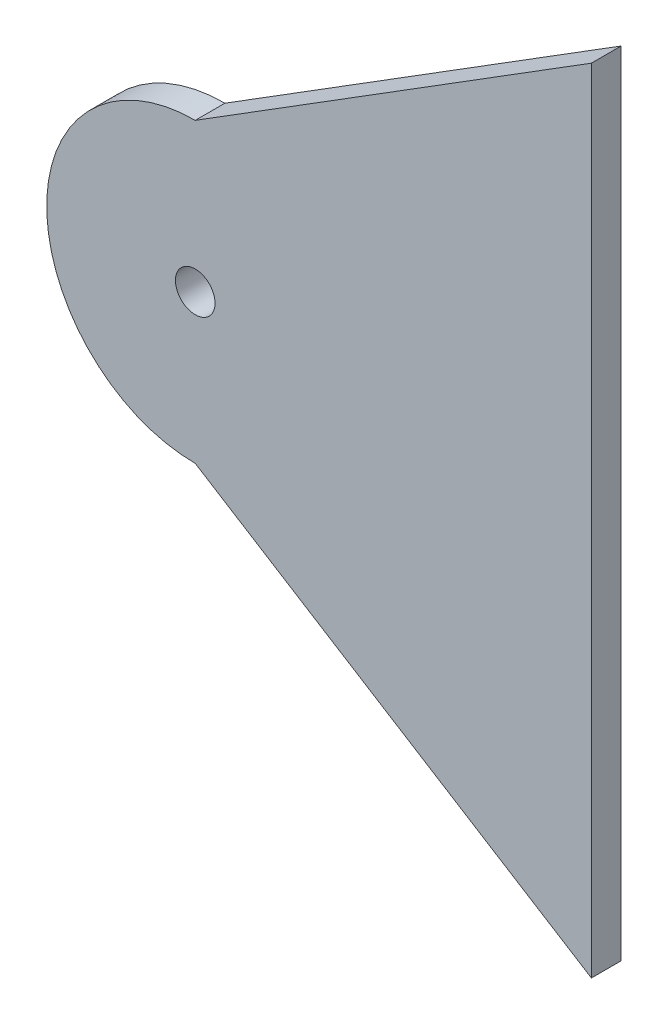
ISO-10303-21;
HEADER;
FILE_DESCRIPTION(('STEP AP214'),'2;1');
FILE_NAME('part.step','',(''),(''),'','','');
FILE_SCHEMA(('AUTOMOTIVE_DESIGN { 1 0 10303 214 1 1 1 1 }'));
ENDSEC;
DATA;
#1=APPLICATION_CONTEXT('core data for automotive mechanical design processes');
#2=APPLICATION_PROTOCOL_DEFINITION('international standard','automotive_design',2000,#1);
#3=PRODUCT_CONTEXT('',#1,'mechanical');
#4=PRODUCT('Part','Part','',(#3));
#5=PRODUCT_RELATED_PRODUCT_CATEGORY('part','',(#4));
#6=PRODUCT_DEFINITION_FORMATION('','',#4);
#7=PRODUCT_DEFINITION_CONTEXT('part definition',#1,'design');
#8=PRODUCT_DEFINITION('design','',#6,#7);
#9=PRODUCT_DEFINITION_SHAPE('','',#8);
#10=(LENGTH_UNIT() NAMED_UNIT(*) SI_UNIT(.MILLI.,.METRE.));
#11=(NAMED_UNIT(*) PLANE_ANGLE_UNIT() SI_UNIT($,.RADIAN.));
#12=(NAMED_UNIT(*) SI_UNIT($,.STERADIAN.) SOLID_ANGLE_UNIT());
#13=UNCERTAINTY_MEASURE_WITH_UNIT(LENGTH_MEASURE(1.E-05),#10,'distance_accuracy_value','');
#14=(GEOMETRIC_REPRESENTATION_CONTEXT(3) GLOBAL_UNCERTAINTY_ASSIGNED_CONTEXT((#13)) GLOBAL_UNIT_ASSIGNED_CONTEXT((#10,
#11,#12)) REPRESENTATION_CONTEXT('',''));
#15=CARTESIAN_POINT('',(0.,0.,0.));
#16=DIRECTION('',(0.,0.,1.));
#17=DIRECTION('',(1.,0.,0.));
#18=AXIS2_PLACEMENT_3D('',#15,#16,#17);
#19=CARTESIAN_POINT('',(254.00258186926,13.7078609778799,3.));
#20=DIRECTION('',(0.,0.,-1.));
#21=DIRECTION('',(-1.,0.,0.));
#22=AXIS2_PLACEMENT_3D('',#19,#20,#21);
#23=PLANE('',#22);
#24=CARTESIAN_POINT('',(254.00258186926,13.7078609778799,3.));
#25=DIRECTION('',(0.,0.,1.));
#26=DIRECTION('',(-1.,0.,0.));
#27=AXIS2_PLACEMENT_3D('',#24,#25,#26);
#28=CIRCLE('',#27,15.);
#29=CARTESIAN_POINT('',(254.00258186926,28.7078609778799,3.));
#30=VERTEX_POINT('',#29);
#31=CARTESIAN_POINT('',(254.00258186926,-1.29213902212011,3.));
#32=VERTEX_POINT('',#31);
#33=EDGE_CURVE('E86',#30,#32,#28,.T.);
#34=ORIENTED_EDGE('',*,*,#33,.T.);
#35=DIRECTION('',(0.847998304005088,-0.52999894000318,0.));
#36=VECTOR('',#35,1.);
#37=CARTESIAN_POINT('',(294.00258186926,-26.2921390221201,3.));
#38=LINE('',#37,#36);
#39=CARTESIAN_POINT('',(294.00258186926,-26.2921390221201,3.));
#40=VERTEX_POINT('',#39);
#41=EDGE_CURVE('E81',#32,#40,#38,.T.);
#42=ORIENTED_EDGE('',*,*,#41,.T.);
#43=DIRECTION('',(0.,1.,0.));
#44=VECTOR('',#43,1.);
#45=CARTESIAN_POINT('',(294.00258186926,13.7078609778799,3.));
#46=LINE('',#45,#44);
#47=CARTESIAN_POINT('',(294.00258186926,53.7078609778799,3.));
#48=VERTEX_POINT('',#47);
#49=EDGE_CURVE('E84',#40,#48,#46,.T.);
#50=ORIENTED_EDGE('',*,*,#49,.T.);
#51=DIRECTION('',(-0.847998304005088,-0.52999894000318,0.));
#52=VECTOR('',#51,1.);
#53=CARTESIAN_POINT('',(254.00258186926,28.7078609778799,3.));
#54=LINE('',#53,#52);
#55=EDGE_CURVE('E52',#48,#30,#54,.T.);
#56=ORIENTED_EDGE('',*,*,#55,.T.);
#57=EDGE_LOOP('',(#34,#42,#50,#56));
#58=FACE_BOUND('',#57,.T.);
#59=CARTESIAN_POINT('',(254.00258186926,13.7078609778799,3.));
#60=DIRECTION('',(0.,0.,1.));
#61=DIRECTION('',(1.,0.,0.));
#62=AXIS2_PLACEMENT_3D('',#59,#60,#61);
#63=CIRCLE('',#62,2.);
#64=CARTESIAN_POINT('',(256.00258186926,13.7078609778799,3.));
#65=VERTEX_POINT('',#64);
#66=EDGE_CURVE('E102',#65,#65,#63,.T.);
#67=ORIENTED_EDGE('',*,*,#66,.F.);
#68=EDGE_LOOP('',(#67));
#69=FACE_BOUND('',#68,.T.);
#70=ADVANCED_FACE('F35',(#58,#69),#23,.F.);
#71=CARTESIAN_POINT('',(254.00258186926,13.7078609778799,0.));
#72=DIRECTION('',(0.,0.,-1.));
#73=DIRECTION('',(-1.,0.,0.));
#74=AXIS2_PLACEMENT_3D('',#71,#72,#73);
#75=PLANE('',#74);
#76=CARTESIAN_POINT('',(254.00258186926,13.7078609778799,0.));
#77=DIRECTION('',(0.,0.,1.));
#78=DIRECTION('',(-1.,0.,0.));
#79=AXIS2_PLACEMENT_3D('',#76,#77,#78);
#80=CIRCLE('',#79,15.);
#81=CARTESIAN_POINT('',(254.00258186926,28.7078609778799,0.));
#82=VERTEX_POINT('',#81);
#83=CARTESIAN_POINT('',(254.00258186926,-1.29213902212011,0.));
#84=VERTEX_POINT('',#83);
#85=EDGE_CURVE('E99',#82,#84,#80,.T.);
#86=ORIENTED_EDGE('',*,*,#85,.F.);
#87=DIRECTION('',(-0.847998304005088,-0.52999894000318,0.));
#88=VECTOR('',#87,1.);
#89=CARTESIAN_POINT('',(254.00258186926,28.7078609778799,0.));
#90=LINE('',#89,#88);
#91=CARTESIAN_POINT('',(294.00258186926,53.7078609778799,0.));
#92=VERTEX_POINT('',#91);
#93=EDGE_CURVE('E74',#92,#82,#90,.T.);
#94=ORIENTED_EDGE('',*,*,#93,.F.);
#95=DIRECTION('',(0.,1.,0.));
#96=VECTOR('',#95,1.);
#97=CARTESIAN_POINT('',(294.00258186926,13.7078609778799,0.));
#98=LINE('',#97,#96);
#99=CARTESIAN_POINT('',(294.00258186926,-26.2921390221201,0.));
#100=VERTEX_POINT('',#99);
#101=EDGE_CURVE('E68',#100,#92,#98,.T.);
#102=ORIENTED_EDGE('',*,*,#101,.F.);
#103=DIRECTION('',(0.847998304005088,-0.52999894000318,0.));
#104=VECTOR('',#103,1.);
#105=CARTESIAN_POINT('',(294.00258186926,-26.2921390221201,0.));
#106=LINE('',#105,#104);
#107=EDGE_CURVE('E91',#84,#100,#106,.T.);
#108=ORIENTED_EDGE('',*,*,#107,.F.);
#109=EDGE_LOOP('',(#86,#94,#102,#108));
#110=FACE_BOUND('',#109,.T.);
#111=CARTESIAN_POINT('',(254.00258186926,13.7078609778799,0.));
#112=DIRECTION('',(0.,0.,1.));
#113=DIRECTION('',(1.,0.,0.));
#114=AXIS2_PLACEMENT_3D('',#111,#112,#113);
#115=CIRCLE('',#114,2.);
#116=CARTESIAN_POINT('',(256.00258186926,13.7078609778799,0.));
#117=VERTEX_POINT('',#116);
#118=EDGE_CURVE('E114',#117,#117,#115,.T.);
#119=ORIENTED_EDGE('',*,*,#118,.T.);
#120=EDGE_LOOP('',(#119));
#121=FACE_BOUND('',#120,.T.);
#122=ADVANCED_FACE('F110',(#110,#121),#75,.T.);
#123=CARTESIAN_POINT('',(254.00258186926,13.7078609778799,3.));
#124=DIRECTION('',(0.,0.,-1.));
#125=DIRECTION('',(-1.,0.,0.));
#126=AXIS2_PLACEMENT_3D('',#123,#124,#125);
#127=CYLINDRICAL_SURFACE('',#126,15.);
#128=ORIENTED_EDGE('',*,*,#85,.T.);
#129=DIRECTION('',(0.,0.,-1.));
#130=VECTOR('',#129,1.);
#131=CARTESIAN_POINT('',(254.00258186926,-1.29213902212011,3.));
#132=LINE('',#131,#130);
#133=EDGE_CURVE('E11',#32,#84,#132,.T.);
#134=ORIENTED_EDGE('',*,*,#133,.F.);
#135=ORIENTED_EDGE('',*,*,#33,.F.);
#136=DIRECTION('',(0.,0.,-1.));
#137=VECTOR('',#136,1.);
#138=CARTESIAN_POINT('',(254.00258186926,28.7078609778799,3.));
#139=LINE('',#138,#137);
#140=EDGE_CURVE('E95',#30,#82,#139,.T.);
#141=ORIENTED_EDGE('',*,*,#140,.T.);
#142=EDGE_LOOP('',(#128,#134,#135,#141));
#143=FACE_BOUND('',#142,.T.);
#144=ADVANCED_FACE('F37',(#143),#127,.T.);
#145=CARTESIAN_POINT('',(294.00258186926,-26.2921390221201,3.));
#146=DIRECTION('',(0.52999894000318,0.847998304005088,0.));
#147=DIRECTION('',(-0.847998304005088,0.52999894000318,0.));
#148=AXIS2_PLACEMENT_3D('',#145,#146,#147);
#149=PLANE('',#148);
#150=ORIENTED_EDGE('',*,*,#107,.T.);
#151=DIRECTION('',(0.,0.,-1.));
#152=VECTOR('',#151,1.);
#153=CARTESIAN_POINT('',(294.00258186926,-26.2921390221201,3.));
#154=LINE('',#153,#152);
#155=EDGE_CURVE('E44',#40,#100,#154,.T.);
#156=ORIENTED_EDGE('',*,*,#155,.F.);
#157=ORIENTED_EDGE('',*,*,#41,.F.);
#158=ORIENTED_EDGE('',*,*,#133,.T.);
#159=EDGE_LOOP('',(#150,#156,#157,#158));
#160=FACE_BOUND('',#159,.T.);
#161=ADVANCED_FACE('F90',(#160),#149,.F.);
#162=CARTESIAN_POINT('',(294.00258186926,13.7078609778799,3.));
#163=DIRECTION('',(-1.,0.,0.));
#164=DIRECTION('',(0.,0.,1.));
#165=AXIS2_PLACEMENT_3D('',#162,#163,#164);
#166=PLANE('',#165);
#167=ORIENTED_EDGE('',*,*,#101,.T.);
#168=DIRECTION('',(0.,0.,-1.));
#169=VECTOR('',#168,1.);
#170=CARTESIAN_POINT('',(294.00258186926,53.7078609778799,3.));
#171=LINE('',#170,#169);
#172=EDGE_CURVE('E92',#48,#92,#171,.T.);
#173=ORIENTED_EDGE('',*,*,#172,.F.);
#174=ORIENTED_EDGE('',*,*,#49,.F.);
#175=ORIENTED_EDGE('',*,*,#155,.T.);
#176=EDGE_LOOP('',(#167,#173,#174,#175));
#177=FACE_BOUND('',#176,.T.);
#178=ADVANCED_FACE('F93',(#177),#166,.F.);
#179=CARTESIAN_POINT('',(254.00258186926,28.7078609778799,3.));
#180=DIRECTION('',(0.52999894000318,-0.847998304005088,0.));
#181=DIRECTION('',(0.847998304005088,0.52999894000318,0.));
#182=AXIS2_PLACEMENT_3D('',#179,#180,#181);
#183=PLANE('',#182);
#184=ORIENTED_EDGE('',*,*,#93,.T.);
#185=ORIENTED_EDGE('',*,*,#140,.F.);
#186=ORIENTED_EDGE('',*,*,#55,.F.);
#187=ORIENTED_EDGE('',*,*,#172,.T.);
#188=EDGE_LOOP('',(#184,#185,#186,#187));
#189=FACE_BOUND('',#188,.T.);
#190=ADVANCED_FACE('F107',(#189),#183,.F.);
#191=CARTESIAN_POINT('',(254.00258186926,13.7078609778799,3.));
#192=DIRECTION('',(0.,0.,-1.));
#193=DIRECTION('',(-1.,0.,0.));
#194=AXIS2_PLACEMENT_3D('',#191,#192,#193);
#195=CYLINDRICAL_SURFACE('',#194,2.);
#196=ORIENTED_EDGE('',*,*,#66,.T.);
#197=EDGE_LOOP('',(#196));
#198=FACE_BOUND('',#197,.T.);
#199=ORIENTED_EDGE('',*,*,#118,.F.);
#200=EDGE_LOOP('',(#199));
#201=FACE_BOUND('',#200,.T.);
#202=ADVANCED_FACE('F120',(#198,#201),#195,.F.);
#203=CLOSED_SHELL('',(#70,#122,#144,#161,#178,#190,#202));
#204=MANIFOLD_SOLID_BREP('B2',#203);
#205=ADVANCED_BREP_SHAPE_REPRESENTATION('',(#18,#204),#14);
#206=SHAPE_DEFINITION_REPRESENTATION(#9,#205);
ENDSEC;
END-ISO-10303-21;
